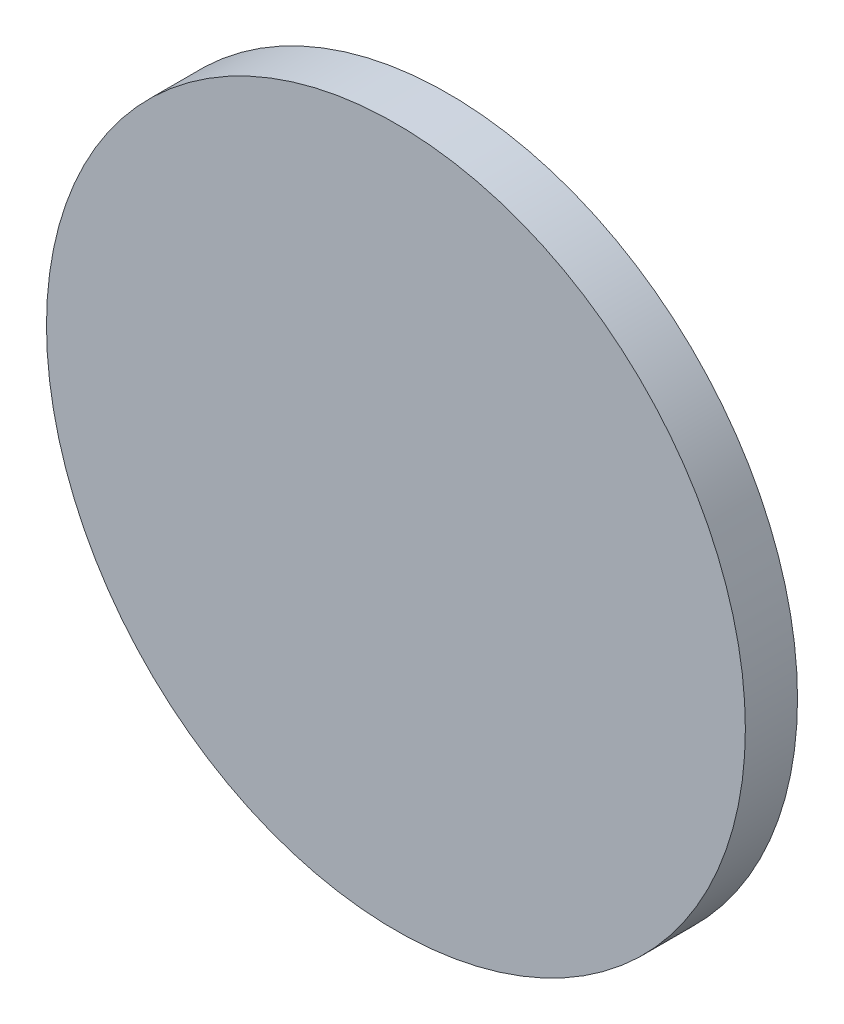
ISO-10303-21;
HEADER;
FILE_DESCRIPTION(('STEP AP214'),'2;1');
FILE_NAME('part.step','',(''),(''),'','','');
FILE_SCHEMA(('AUTOMOTIVE_DESIGN { 1 0 10303 214 1 1 1 1 }'));
ENDSEC;
DATA;
#1=APPLICATION_CONTEXT('core data for automotive mechanical design processes');
#2=APPLICATION_PROTOCOL_DEFINITION('international standard','automotive_design',2000,#1);
#3=PRODUCT_CONTEXT('',#1,'mechanical');
#4=PRODUCT('Part','Part','',(#3));
#5=PRODUCT_RELATED_PRODUCT_CATEGORY('part','',(#4));
#6=PRODUCT_DEFINITION_FORMATION('','',#4);
#7=PRODUCT_DEFINITION_CONTEXT('part definition',#1,'design');
#8=PRODUCT_DEFINITION('design','',#6,#7);
#9=PRODUCT_DEFINITION_SHAPE('','',#8);
#10=(LENGTH_UNIT() NAMED_UNIT(*) SI_UNIT(.MILLI.,.METRE.));
#11=(NAMED_UNIT(*) PLANE_ANGLE_UNIT() SI_UNIT($,.RADIAN.));
#12=(NAMED_UNIT(*) SI_UNIT($,.STERADIAN.) SOLID_ANGLE_UNIT());
#13=UNCERTAINTY_MEASURE_WITH_UNIT(LENGTH_MEASURE(1.E-05),#10,'distance_accuracy_value','');
#14=(GEOMETRIC_REPRESENTATION_CONTEXT(3) GLOBAL_UNCERTAINTY_ASSIGNED_CONTEXT((#13)) GLOBAL_UNIT_ASSIGNED_CONTEXT((#10,
#11,#12)) REPRESENTATION_CONTEXT('',''));
#15=CARTESIAN_POINT('',(0.,0.,0.));
#16=DIRECTION('',(0.,0.,1.));
#17=DIRECTION('',(1.,0.,0.));
#18=AXIS2_PLACEMENT_3D('',#15,#16,#17);
#19=CARTESIAN_POINT('',(70.,-172.32015122265,649.778128030608));
#20=DIRECTION('',(0.,0.,-1.));
#21=DIRECTION('',(-1.,0.,0.));
#22=AXIS2_PLACEMENT_3D('',#19,#20,#21);
#23=CYLINDRICAL_SURFACE('',#22,335.);
#24=CARTESIAN_POINT('',(70.,-172.32015122265,649.778128030608));
#25=DIRECTION('',(0.,0.,1.));
#26=DIRECTION('',(1.,0.,0.));
#27=AXIS2_PLACEMENT_3D('',#24,#25,#26);
#28=CIRCLE('',#27,335.);
#29=CARTESIAN_POINT('',(405.,-172.32015122265,649.778128030608));
#30=VERTEX_POINT('',#29);
#31=EDGE_CURVE('E10',#30,#30,#28,.T.);
#32=ORIENTED_EDGE('',*,*,#31,.F.);
#33=EDGE_LOOP('',(#32));
#34=FACE_BOUND('',#33,.T.);
#35=CARTESIAN_POINT('',(70.,-172.32015122265,599.778128030608));
#36=DIRECTION('',(0.,0.,1.));
#37=DIRECTION('',(1.,0.,0.));
#38=AXIS2_PLACEMENT_3D('',#35,#36,#37);
#39=CIRCLE('',#38,335.);
#40=CARTESIAN_POINT('',(405.,-172.32015122265,599.778128030608));
#41=VERTEX_POINT('',#40);
#42=EDGE_CURVE('E42',#41,#41,#39,.T.);
#43=ORIENTED_EDGE('',*,*,#42,.T.);
#44=EDGE_LOOP('',(#43));
#45=FACE_BOUND('',#44,.T.);
#46=ADVANCED_FACE('F39',(#34,#45),#23,.T.);
#47=CARTESIAN_POINT('',(70.,-172.32015122265,649.778128030608));
#48=DIRECTION('',(0.,0.,1.));
#49=DIRECTION('',(1.,0.,0.));
#50=AXIS2_PLACEMENT_3D('',#47,#48,#49);
#51=PLANE('',#50);
#52=ORIENTED_EDGE('',*,*,#31,.T.);
#53=EDGE_LOOP('',(#52));
#54=FACE_BOUND('',#53,.T.);
#55=ADVANCED_FACE('F54',(#54),#51,.T.);
#56=CARTESIAN_POINT('',(70.,-172.32015122265,599.778128030608));
#57=DIRECTION('',(0.,0.,1.));
#58=DIRECTION('',(1.,0.,0.));
#59=AXIS2_PLACEMENT_3D('',#56,#57,#58);
#60=PLANE('',#59);
#61=ORIENTED_EDGE('',*,*,#42,.F.);
#62=EDGE_LOOP('',(#61));
#63=FACE_BOUND('',#62,.T.);
#64=ADVANCED_FACE('F52',(#63),#60,.F.);
#65=CLOSED_SHELL('',(#46,#55,#64));
#66=MANIFOLD_SOLID_BREP('B2',#65);
#67=ADVANCED_BREP_SHAPE_REPRESENTATION('',(#18,#66),#14);
#68=SHAPE_DEFINITION_REPRESENTATION(#9,#67);
ENDSEC;
END-ISO-10303-21;
